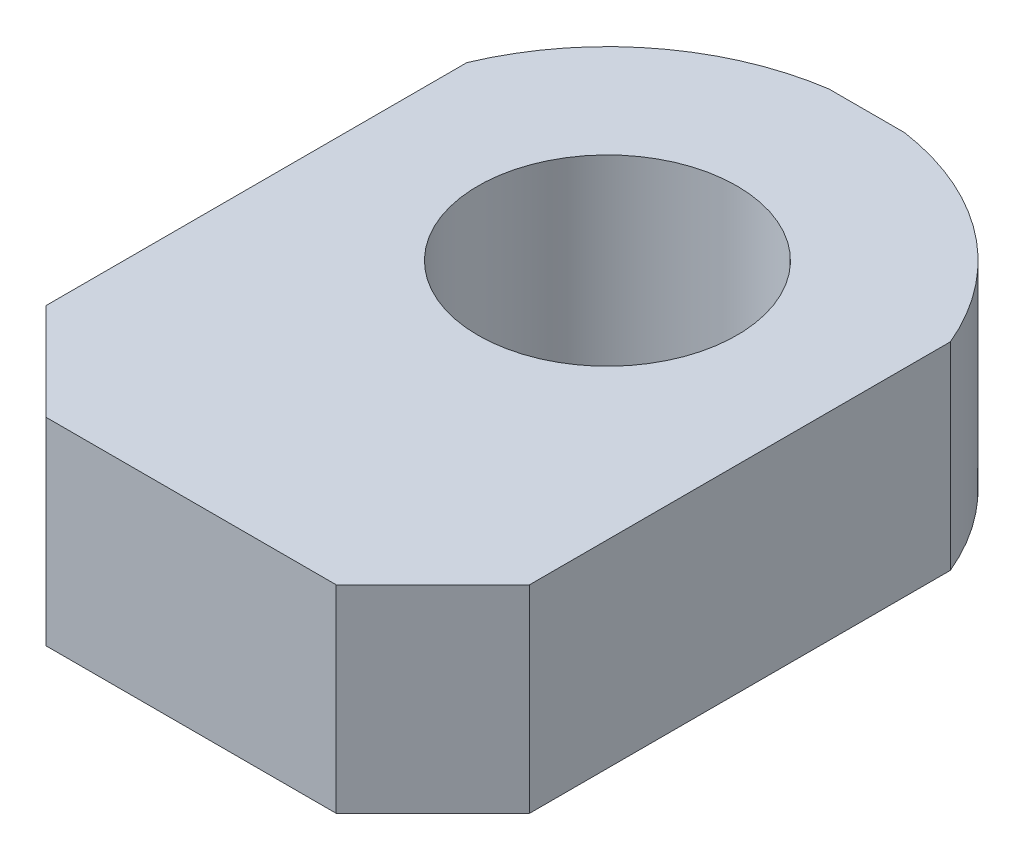
ISO-10303-21;
HEADER;
FILE_DESCRIPTION(('STEP AP214'),'2;1');
FILE_NAME('part.step','',(''),(''),'','','');
FILE_SCHEMA(('AUTOMOTIVE_DESIGN { 1 0 10303 214 1 1 1 1 }'));
ENDSEC;
DATA;
#1=APPLICATION_CONTEXT('core data for automotive mechanical design processes');
#2=APPLICATION_PROTOCOL_DEFINITION('international standard','automotive_design',2000,#1);
#3=PRODUCT_CONTEXT('',#1,'mechanical');
#4=PRODUCT('Part','Part','',(#3));
#5=PRODUCT_RELATED_PRODUCT_CATEGORY('part','',(#4));
#6=PRODUCT_DEFINITION_FORMATION('','',#4);
#7=PRODUCT_DEFINITION_CONTEXT('part definition',#1,'design');
#8=PRODUCT_DEFINITION('design','',#6,#7);
#9=PRODUCT_DEFINITION_SHAPE('','',#8);
#10=(LENGTH_UNIT() NAMED_UNIT(*) SI_UNIT(.MILLI.,.METRE.));
#11=(NAMED_UNIT(*) PLANE_ANGLE_UNIT() SI_UNIT($,.RADIAN.));
#12=(NAMED_UNIT(*) SI_UNIT($,.STERADIAN.) SOLID_ANGLE_UNIT());
#13=UNCERTAINTY_MEASURE_WITH_UNIT(LENGTH_MEASURE(1.E-05),#10,'distance_accuracy_value','');
#14=(GEOMETRIC_REPRESENTATION_CONTEXT(3) GLOBAL_UNCERTAINTY_ASSIGNED_CONTEXT((#13)) GLOBAL_UNIT_ASSIGNED_CONTEXT((#10,
#11,#12)) REPRESENTATION_CONTEXT('',''));
#15=CARTESIAN_POINT('',(0.,0.,0.));
#16=DIRECTION('',(0.,0.,1.));
#17=DIRECTION('',(1.,0.,0.));
#18=AXIS2_PLACEMENT_3D('',#15,#16,#17);
#19=CARTESIAN_POINT('',(0.,11.7,0.));
#20=DIRECTION('',(0.,-1.,0.));
#21=DIRECTION('',(0.,0.,-1.));
#22=AXIS2_PLACEMENT_3D('',#19,#20,#21);
#23=PLANE('',#22);
#24=CARTESIAN_POINT('',(0.,11.7,0.));
#25=DIRECTION('',(0.,1.,0.));
#26=DIRECTION('',(0.,0.,-1.));
#27=AXIS2_PLACEMENT_3D('',#24,#25,#26);
#28=CIRCLE('',#27,15.49);
#29=CARTESIAN_POINT('',(-2.22063054108512,11.7,-15.33));
#30=VERTEX_POINT('',#29);
#31=CARTESIAN_POINT('',(-14.29,11.7,-5.97795951809646));
#32=VERTEX_POINT('',#31);
#33=EDGE_CURVE('E149',#30,#32,#28,.T.);
#34=ORIENTED_EDGE('',*,*,#33,.T.);
#35=DIRECTION('',(0.,0.,1.));
#36=VECTOR('',#35,1.);
#37=CARTESIAN_POINT('',(-14.29,11.7,-5.97795951809646));
#38=LINE('',#37,#36);
#39=CARTESIAN_POINT('',(-14.29,11.7,18.894));
#40=VERTEX_POINT('',#39);
#41=EDGE_CURVE('E97',#32,#40,#38,.T.);
#42=ORIENTED_EDGE('',*,*,#41,.T.);
#43=DIRECTION('',(0.707106781186547,0.,0.707106781186548));
#44=VECTOR('',#43,1.);
#45=CARTESIAN_POINT('',(-14.29,11.7,18.894));
#46=LINE('',#45,#44);
#47=CARTESIAN_POINT('',(-8.574,11.7,24.61));
#48=VERTEX_POINT('',#47);
#49=EDGE_CURVE('E164',#40,#48,#46,.T.);
#50=ORIENTED_EDGE('',*,*,#49,.T.);
#51=DIRECTION('',(1.,0.,0.));
#52=VECTOR('',#51,1.);
#53=CARTESIAN_POINT('',(-8.574,11.7,24.61));
#54=LINE('',#53,#52);
#55=CARTESIAN_POINT('',(8.574,11.7,24.61));
#56=VERTEX_POINT('',#55);
#57=EDGE_CURVE('E177',#48,#56,#54,.T.);
#58=ORIENTED_EDGE('',*,*,#57,.T.);
#59=DIRECTION('',(0.707106781186547,0.,-0.707106781186548));
#60=VECTOR('',#59,1.);
#61=CARTESIAN_POINT('',(8.574,11.7,24.61));
#62=LINE('',#61,#60);
#63=CARTESIAN_POINT('',(14.29,11.7,18.894));
#64=VERTEX_POINT('',#63);
#65=EDGE_CURVE('E116',#56,#64,#62,.T.);
#66=ORIENTED_EDGE('',*,*,#65,.T.);
#67=DIRECTION('',(0.,0.,-1.));
#68=VECTOR('',#67,1.);
#69=CARTESIAN_POINT('',(14.29,11.7,18.894));
#70=LINE('',#69,#68);
#71=CARTESIAN_POINT('',(14.29,11.7,-5.97795951809646));
#72=VERTEX_POINT('',#71);
#73=EDGE_CURVE('E110',#64,#72,#70,.T.);
#74=ORIENTED_EDGE('',*,*,#73,.T.);
#75=CARTESIAN_POINT('',(0.,11.7,0.));
#76=DIRECTION('',(0.,1.,0.));
#77=DIRECTION('',(0.,0.,-1.));
#78=AXIS2_PLACEMENT_3D('',#75,#76,#77);
#79=CIRCLE('',#78,15.49);
#80=CARTESIAN_POINT('',(2.22063054108512,11.7,-15.33));
#81=VERTEX_POINT('',#80);
#82=EDGE_CURVE('E114',#72,#81,#79,.T.);
#83=ORIENTED_EDGE('',*,*,#82,.T.);
#84=DIRECTION('',(-1.,0.,0.));
#85=VECTOR('',#84,1.);
#86=CARTESIAN_POINT('',(-2.22063054108512,11.7,-15.33));
#87=LINE('',#86,#85);
#88=EDGE_CURVE('E54',#81,#30,#87,.T.);
#89=ORIENTED_EDGE('',*,*,#88,.T.);
#90=EDGE_LOOP('',(#34,#42,#50,#58,#66,#74,#83,#89));
#91=FACE_BOUND('',#90,.T.);
#92=CARTESIAN_POINT('',(0.,11.7,0.));
#93=DIRECTION('',(0.,1.,0.));
#94=DIRECTION('',(0.,0.,1.));
#95=AXIS2_PLACEMENT_3D('',#92,#93,#94);
#96=CIRCLE('',#95,7.65);
#97=CARTESIAN_POINT('',(0.,11.7,7.65));
#98=VERTEX_POINT('',#97);
#99=EDGE_CURVE('E138',#98,#98,#96,.T.);
#100=ORIENTED_EDGE('',*,*,#99,.F.);
#101=EDGE_LOOP('',(#100));
#102=FACE_BOUND('',#101,.T.);
#103=ADVANCED_FACE('F37',(#91,#102),#23,.F.);
#104=CARTESIAN_POINT('',(0.,0.,0.));
#105=DIRECTION('',(0.,-1.,0.));
#106=DIRECTION('',(0.,0.,-1.));
#107=AXIS2_PLACEMENT_3D('',#104,#105,#106);
#108=PLANE('',#107);
#109=CARTESIAN_POINT('',(0.,0.,0.));
#110=DIRECTION('',(0.,1.,0.));
#111=DIRECTION('',(0.,0.,-1.));
#112=AXIS2_PLACEMENT_3D('',#109,#110,#111);
#113=CIRCLE('',#112,15.49);
#114=CARTESIAN_POINT('',(-2.22063054108512,0.,-15.33));
#115=VERTEX_POINT('',#114);
#116=CARTESIAN_POINT('',(-14.29,0.,-5.97795951809646));
#117=VERTEX_POINT('',#116);
#118=EDGE_CURVE('E134',#115,#117,#113,.T.);
#119=ORIENTED_EDGE('',*,*,#118,.F.);
#120=DIRECTION('',(-1.,0.,0.));
#121=VECTOR('',#120,1.);
#122=CARTESIAN_POINT('',(-2.22063054108512,0.,-15.33));
#123=LINE('',#122,#121);
#124=CARTESIAN_POINT('',(2.22063054108512,0.,-15.33));
#125=VERTEX_POINT('',#124);
#126=EDGE_CURVE('E89',#125,#115,#123,.T.);
#127=ORIENTED_EDGE('',*,*,#126,.F.);
#128=CARTESIAN_POINT('',(0.,0.,0.));
#129=DIRECTION('',(0.,1.,0.));
#130=DIRECTION('',(0.,0.,-1.));
#131=AXIS2_PLACEMENT_3D('',#128,#129,#130);
#132=CIRCLE('',#131,15.49);
#133=CARTESIAN_POINT('',(14.29,0.,-5.97795951809646));
#134=VERTEX_POINT('',#133);
#135=EDGE_CURVE('E83',#134,#125,#132,.T.);
#136=ORIENTED_EDGE('',*,*,#135,.F.);
#137=DIRECTION('',(0.,0.,-1.));
#138=VECTOR('',#137,1.);
#139=CARTESIAN_POINT('',(14.29,0.,18.894));
#140=LINE('',#139,#138);
#141=CARTESIAN_POINT('',(14.29,0.,18.894));
#142=VERTEX_POINT('',#141);
#143=EDGE_CURVE('E124',#142,#134,#140,.T.);
#144=ORIENTED_EDGE('',*,*,#143,.F.);
#145=DIRECTION('',(0.707106781186547,0.,-0.707106781186548));
#146=VECTOR('',#145,1.);
#147=CARTESIAN_POINT('',(8.574,0.,24.61));
#148=LINE('',#147,#146);
#149=CARTESIAN_POINT('',(8.574,0.,24.61));
#150=VERTEX_POINT('',#149);
#151=EDGE_CURVE('E144',#150,#142,#148,.T.);
#152=ORIENTED_EDGE('',*,*,#151,.F.);
#153=DIRECTION('',(1.,0.,0.));
#154=VECTOR('',#153,1.);
#155=CARTESIAN_POINT('',(-8.574,0.,24.61));
#156=LINE('',#155,#154);
#157=CARTESIAN_POINT('',(-8.574,0.,24.61));
#158=VERTEX_POINT('',#157);
#159=EDGE_CURVE('E142',#158,#150,#156,.T.);
#160=ORIENTED_EDGE('',*,*,#159,.F.);
#161=DIRECTION('',(0.707106781186547,0.,0.707106781186548));
#162=VECTOR('',#161,1.);
#163=CARTESIAN_POINT('',(-14.29,0.,18.894));
#164=LINE('',#163,#162);
#165=CARTESIAN_POINT('',(-14.29,0.,18.894));
#166=VERTEX_POINT('',#165);
#167=EDGE_CURVE('E140',#166,#158,#164,.T.);
#168=ORIENTED_EDGE('',*,*,#167,.F.);
#169=DIRECTION('',(0.,0.,1.));
#170=VECTOR('',#169,1.);
#171=CARTESIAN_POINT('',(-14.29,0.,-5.97795951809646));
#172=LINE('',#171,#170);
#173=EDGE_CURVE('E137',#117,#166,#172,.T.);
#174=ORIENTED_EDGE('',*,*,#173,.F.);
#175=EDGE_LOOP('',(#119,#127,#136,#144,#152,#160,#168,#174));
#176=FACE_BOUND('',#175,.T.);
#177=CARTESIAN_POINT('',(0.,0.,0.));
#178=DIRECTION('',(0.,1.,0.));
#179=DIRECTION('',(0.,0.,1.));
#180=AXIS2_PLACEMENT_3D('',#177,#178,#179);
#181=CIRCLE('',#180,7.65);
#182=CARTESIAN_POINT('',(0.,0.,7.65));
#183=VERTEX_POINT('',#182);
#184=EDGE_CURVE('E183',#183,#183,#181,.T.);
#185=ORIENTED_EDGE('',*,*,#184,.T.);
#186=EDGE_LOOP('',(#185));
#187=FACE_BOUND('',#186,.T.);
#188=ADVANCED_FACE('F168',(#176,#187),#108,.T.);
#189=CARTESIAN_POINT('',(0.,11.7,0.));
#190=DIRECTION('',(0.,-1.,0.));
#191=DIRECTION('',(0.,0.,-1.));
#192=AXIS2_PLACEMENT_3D('',#189,#190,#191);
#193=CYLINDRICAL_SURFACE('',#192,15.49);
#194=ORIENTED_EDGE('',*,*,#118,.T.);
#195=DIRECTION('',(0.,-1.,0.));
#196=VECTOR('',#195,1.);
#197=CARTESIAN_POINT('',(-14.29,11.7,-5.97795951809646));
#198=LINE('',#197,#196);
#199=EDGE_CURVE('E11',#32,#117,#198,.T.);
#200=ORIENTED_EDGE('',*,*,#199,.F.);
#201=ORIENTED_EDGE('',*,*,#33,.F.);
#202=DIRECTION('',(0.,-1.,0.));
#203=VECTOR('',#202,1.);
#204=CARTESIAN_POINT('',(-2.22063054108512,11.7,-15.33));
#205=LINE('',#204,#203);
#206=EDGE_CURVE('E130',#30,#115,#205,.T.);
#207=ORIENTED_EDGE('',*,*,#206,.T.);
#208=EDGE_LOOP('',(#194,#200,#201,#207));
#209=FACE_BOUND('',#208,.T.);
#210=ADVANCED_FACE('F39',(#209),#193,.T.);
#211=CARTESIAN_POINT('',(-14.29,11.7,-5.97795951809646));
#212=DIRECTION('',(1.,0.,0.));
#213=DIRECTION('',(0.,0.,-1.));
#214=AXIS2_PLACEMENT_3D('',#211,#212,#213);
#215=PLANE('',#214);
#216=ORIENTED_EDGE('',*,*,#173,.T.);
#217=DIRECTION('',(0.,-1.,0.));
#218=VECTOR('',#217,1.);
#219=CARTESIAN_POINT('',(-14.29,11.7,18.894));
#220=LINE('',#219,#218);
#221=EDGE_CURVE('E46',#40,#166,#220,.T.);
#222=ORIENTED_EDGE('',*,*,#221,.F.);
#223=ORIENTED_EDGE('',*,*,#41,.F.);
#224=ORIENTED_EDGE('',*,*,#199,.T.);
#225=EDGE_LOOP('',(#216,#222,#223,#224));
#226=FACE_BOUND('',#225,.T.);
#227=ADVANCED_FACE('F211',(#226),#215,.F.);
#228=CARTESIAN_POINT('',(-14.29,11.7,18.894));
#229=DIRECTION('',(0.707106781186548,0.,-0.707106781186547));
#230=DIRECTION('',(-0.707106781186547,0.,-0.707106781186548));
#231=AXIS2_PLACEMENT_3D('',#228,#229,#230);
#232=PLANE('',#231);
#233=ORIENTED_EDGE('',*,*,#167,.T.);
#234=DIRECTION('',(0.,-1.,0.));
#235=VECTOR('',#234,1.);
#236=CARTESIAN_POINT('',(-8.574,11.7,24.61));
#237=LINE('',#236,#235);
#238=EDGE_CURVE('E156',#48,#158,#237,.T.);
#239=ORIENTED_EDGE('',*,*,#238,.F.);
#240=ORIENTED_EDGE('',*,*,#49,.F.);
#241=ORIENTED_EDGE('',*,*,#221,.T.);
#242=EDGE_LOOP('',(#233,#239,#240,#241));
#243=FACE_BOUND('',#242,.T.);
#244=ADVANCED_FACE('F162',(#243),#232,.F.);
#245=CARTESIAN_POINT('',(-8.574,11.7,24.61));
#246=DIRECTION('',(0.,0.,-1.));
#247=DIRECTION('',(-1.,0.,0.));
#248=AXIS2_PLACEMENT_3D('',#245,#246,#247);
#249=PLANE('',#248);
#250=ORIENTED_EDGE('',*,*,#159,.T.);
#251=DIRECTION('',(0.,-1.,0.));
#252=VECTOR('',#251,1.);
#253=CARTESIAN_POINT('',(8.574,11.7,24.61));
#254=LINE('',#253,#252);
#255=EDGE_CURVE('E153',#56,#150,#254,.T.);
#256=ORIENTED_EDGE('',*,*,#255,.F.);
#257=ORIENTED_EDGE('',*,*,#57,.F.);
#258=ORIENTED_EDGE('',*,*,#238,.T.);
#259=EDGE_LOOP('',(#250,#256,#257,#258));
#260=FACE_BOUND('',#259,.T.);
#261=ADVANCED_FACE('F173',(#260),#249,.F.);
#262=CARTESIAN_POINT('',(8.574,11.7,24.61));
#263=DIRECTION('',(-0.707106781186548,0.,-0.707106781186547));
#264=DIRECTION('',(-0.707106781186547,0.,0.707106781186548));
#265=AXIS2_PLACEMENT_3D('',#262,#263,#264);
#266=PLANE('',#265);
#267=ORIENTED_EDGE('',*,*,#151,.T.);
#268=DIRECTION('',(0.,-1.,0.));
#269=VECTOR('',#268,1.);
#270=CARTESIAN_POINT('',(14.29,11.7,18.894));
#271=LINE('',#270,#269);
#272=EDGE_CURVE('E125',#64,#142,#271,.T.);
#273=ORIENTED_EDGE('',*,*,#272,.F.);
#274=ORIENTED_EDGE('',*,*,#65,.F.);
#275=ORIENTED_EDGE('',*,*,#255,.T.);
#276=EDGE_LOOP('',(#267,#273,#274,#275));
#277=FACE_BOUND('',#276,.T.);
#278=ADVANCED_FACE('F176',(#277),#266,.F.);
#279=CARTESIAN_POINT('',(14.29,11.7,18.894));
#280=DIRECTION('',(-1.,0.,0.));
#281=DIRECTION('',(0.,0.,1.));
#282=AXIS2_PLACEMENT_3D('',#279,#280,#281);
#283=PLANE('',#282);
#284=ORIENTED_EDGE('',*,*,#143,.T.);
#285=DIRECTION('',(0.,-1.,0.));
#286=VECTOR('',#285,1.);
#287=CARTESIAN_POINT('',(14.29,11.7,-5.97795951809646));
#288=LINE('',#287,#286);
#289=EDGE_CURVE('E121',#72,#134,#288,.T.);
#290=ORIENTED_EDGE('',*,*,#289,.F.);
#291=ORIENTED_EDGE('',*,*,#73,.F.);
#292=ORIENTED_EDGE('',*,*,#272,.T.);
#293=EDGE_LOOP('',(#284,#290,#291,#292));
#294=FACE_BOUND('',#293,.T.);
#295=ADVANCED_FACE('F122',(#294),#283,.F.);
#296=CARTESIAN_POINT('',(0.,11.7,0.));
#297=DIRECTION('',(0.,-1.,0.));
#298=DIRECTION('',(0.,0.,-1.));
#299=AXIS2_PLACEMENT_3D('',#296,#297,#298);
#300=CYLINDRICAL_SURFACE('',#299,15.49);
#301=ORIENTED_EDGE('',*,*,#135,.T.);
#302=DIRECTION('',(0.,-1.,0.));
#303=VECTOR('',#302,1.);
#304=CARTESIAN_POINT('',(2.22063054108512,11.7,-15.33));
#305=LINE('',#304,#303);
#306=EDGE_CURVE('E126',#81,#125,#305,.T.);
#307=ORIENTED_EDGE('',*,*,#306,.F.);
#308=ORIENTED_EDGE('',*,*,#82,.F.);
#309=ORIENTED_EDGE('',*,*,#289,.T.);
#310=EDGE_LOOP('',(#301,#307,#308,#309));
#311=FACE_BOUND('',#310,.T.);
#312=ADVANCED_FACE('F128',(#311),#300,.T.);
#313=CARTESIAN_POINT('',(-2.22063054108512,11.7,-15.33));
#314=DIRECTION('',(0.,0.,1.));
#315=DIRECTION('',(1.,0.,0.));
#316=AXIS2_PLACEMENT_3D('',#313,#314,#315);
#317=PLANE('',#316);
#318=ORIENTED_EDGE('',*,*,#126,.T.);
#319=ORIENTED_EDGE('',*,*,#206,.F.);
#320=ORIENTED_EDGE('',*,*,#88,.F.);
#321=ORIENTED_EDGE('',*,*,#306,.T.);
#322=EDGE_LOOP('',(#318,#319,#320,#321));
#323=FACE_BOUND('',#322,.T.);
#324=ADVANCED_FACE('F199',(#323),#317,.F.);
#325=CARTESIAN_POINT('',(0.,11.7,0.));
#326=DIRECTION('',(0.,-1.,0.));
#327=DIRECTION('',(0.,0.,-1.));
#328=AXIS2_PLACEMENT_3D('',#325,#326,#327);
#329=CYLINDRICAL_SURFACE('',#328,7.65);
#330=ORIENTED_EDGE('',*,*,#99,.T.);
#331=EDGE_LOOP('',(#330));
#332=FACE_BOUND('',#331,.T.);
#333=ORIENTED_EDGE('',*,*,#184,.F.);
#334=EDGE_LOOP('',(#333));
#335=FACE_BOUND('',#334,.T.);
#336=ADVANCED_FACE('F189',(#332,#335),#329,.F.);
#337=CLOSED_SHELL('',(#103,#188,#210,#227,#244,#261,#278,#295,#312,#324,#336));
#338=MANIFOLD_SOLID_BREP('B2',#337);
#339=ADVANCED_BREP_SHAPE_REPRESENTATION('',(#18,#338),#14);
#340=SHAPE_DEFINITION_REPRESENTATION(#9,#339);
ENDSEC;
END-ISO-10303-21;
